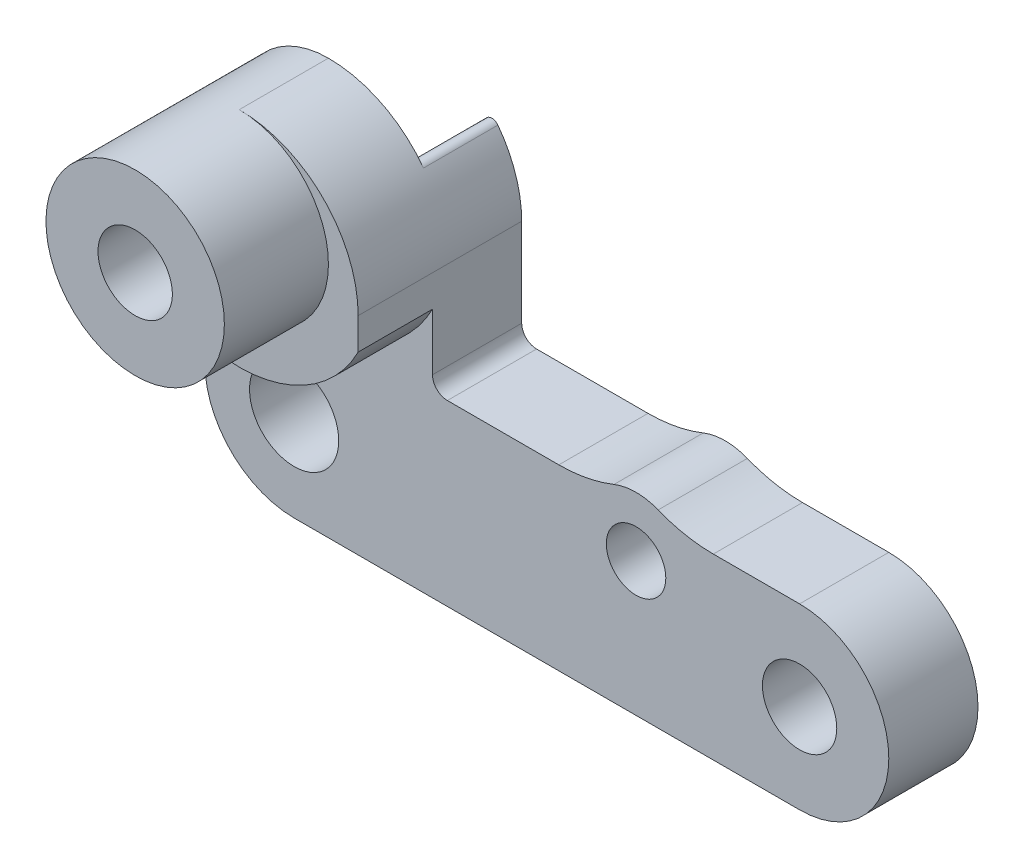
ISO-10303-21;
HEADER;
FILE_DESCRIPTION(('STEP AP214'),'2;1');
FILE_NAME('part.step','',(''),(''),'','','');
FILE_SCHEMA(('AUTOMOTIVE_DESIGN { 1 0 10303 214 1 1 1 1 }'));
ENDSEC;
DATA;
#1=APPLICATION_CONTEXT('core data for automotive mechanical design processes');
#2=APPLICATION_PROTOCOL_DEFINITION('international standard','automotive_design',2000,#1);
#3=PRODUCT_CONTEXT('',#1,'mechanical');
#4=PRODUCT('Part','Part','',(#3));
#5=PRODUCT_RELATED_PRODUCT_CATEGORY('part','',(#4));
#6=PRODUCT_DEFINITION_FORMATION('','',#4);
#7=PRODUCT_DEFINITION_CONTEXT('part definition',#1,'design');
#8=PRODUCT_DEFINITION('design','',#6,#7);
#9=PRODUCT_DEFINITION_SHAPE('','',#8);
#10=(LENGTH_UNIT() NAMED_UNIT(*) SI_UNIT(.MILLI.,.METRE.));
#11=(NAMED_UNIT(*) PLANE_ANGLE_UNIT() SI_UNIT($,.RADIAN.));
#12=(NAMED_UNIT(*) SI_UNIT($,.STERADIAN.) SOLID_ANGLE_UNIT());
#13=UNCERTAINTY_MEASURE_WITH_UNIT(LENGTH_MEASURE(1.E-05),#10,'distance_accuracy_value','');
#14=(GEOMETRIC_REPRESENTATION_CONTEXT(3) GLOBAL_UNCERTAINTY_ASSIGNED_CONTEXT((#13)) GLOBAL_UNIT_ASSIGNED_CONTEXT((#10,
#11,#12)) REPRESENTATION_CONTEXT('',''));
#15=CARTESIAN_POINT('',(0.,0.,0.));
#16=DIRECTION('',(0.,0.,1.));
#17=DIRECTION('',(1.,0.,0.));
#18=AXIS2_PLACEMENT_3D('',#15,#16,#17);
#19=CARTESIAN_POINT('',(0.,3.52853976431191,4.));
#20=DIRECTION('',(0.,-1.,0.));
#21=DIRECTION('',(1.,0.,0.));
#22=AXIS2_PLACEMENT_3D('',#19,#20,#21);
#23=PLANE('',#22);
#24=DIRECTION('',(-1.,0.,0.));
#25=VECTOR('',#24,1.);
#26=CARTESIAN_POINT('',(0.,3.52853976431191,1.));
#27=LINE('',#26,#25);
#28=CARTESIAN_POINT('',(16.3463319293926,3.52853976431191,1.));
#29=VERTEX_POINT('',#28);
#30=CARTESIAN_POINT('',(13.4444081407459,3.52853976431191,1.));
#31=VERTEX_POINT('',#30);
#32=EDGE_CURVE('E348',#29,#31,#27,.T.);
#33=ORIENTED_EDGE('',*,*,#32,.T.);
#34=DIRECTION('',(0.,0.,1.));
#35=VECTOR('',#34,1.);
#36=CARTESIAN_POINT('',(13.4444081407459,3.52853976431191,4.));
#37=LINE('',#36,#35);
#38=CARTESIAN_POINT('',(13.4444081407459,3.52853976431191,4.));
#39=VERTEX_POINT('',#38);
#40=EDGE_CURVE('E412',#31,#39,#37,.T.);
#41=ORIENTED_EDGE('',*,*,#40,.T.);
#42=DIRECTION('',(-1.,0.,0.));
#43=VECTOR('',#42,1.);
#44=CARTESIAN_POINT('',(0.,3.52853976431191,4.));
#45=LINE('',#44,#43);
#46=CARTESIAN_POINT('',(16.3463319293926,3.52853976431191,4.));
#47=VERTEX_POINT('',#46);
#48=EDGE_CURVE('E271',#47,#39,#45,.T.);
#49=ORIENTED_EDGE('',*,*,#48,.F.);
#50=DIRECTION('',(0.,0.,-1.));
#51=VECTOR('',#50,1.);
#52=CARTESIAN_POINT('',(16.3463319293926,3.52853976431191,4.));
#53=LINE('',#52,#51);
#54=EDGE_CURVE('E294',#47,#29,#53,.T.);
#55=ORIENTED_EDGE('',*,*,#54,.T.);
#56=EDGE_LOOP('',(#33,#41,#49,#55));
#57=FACE_BOUND('',#56,.T.);
#58=ADVANCED_FACE('F41',(#57),#23,.F.);
#59=CARTESIAN_POINT('',(0.,8.,10.));
#60=DIRECTION('',(0.,0.,-1.));
#61=DIRECTION('',(-1.,0.,0.));
#62=AXIS2_PLACEMENT_3D('',#59,#60,#61);
#63=CYLINDRICAL_SURFACE('',#62,3.);
#64=CARTESIAN_POINT('',(0.,8.,6.5));
#65=DIRECTION('',(0.,0.,1.));
#66=DIRECTION('',(1.,0.,0.));
#67=AXIS2_PLACEMENT_3D('',#64,#65,#66);
#68=CIRCLE('',#67,3.);
#69=CARTESIAN_POINT('',(0.,11.,6.5));
#70=VERTEX_POINT('',#69);
#71=CARTESIAN_POINT('',(-2.93253436583307,7.36735302639778,6.5));
#72=VERTEX_POINT('',#71);
#73=EDGE_CURVE('E229',#70,#72,#68,.F.);
#74=ORIENTED_EDGE('',*,*,#73,.F.);
#75=DIRECTION('',(0.,0.,-1.));
#76=VECTOR('',#75,1.);
#77=CARTESIAN_POINT('',(0.,11.,4.));
#78=LINE('',#77,#76);
#79=CARTESIAN_POINT('',(0.,11.,3.5));
#80=VERTEX_POINT('',#79);
#81=EDGE_CURVE('E286',#70,#80,#78,.T.);
#82=ORIENTED_EDGE('',*,*,#81,.T.);
#83=CARTESIAN_POINT('',(0.,8.,3.5));
#84=DIRECTION('',(0.,0.,-1.));
#85=DIRECTION('',(-1.,0.,0.));
#86=AXIS2_PLACEMENT_3D('',#83,#84,#85);
#87=CIRCLE('',#86,3.);
#88=CARTESIAN_POINT('',(-2.93253436583307,7.36735302639777,3.5));
#89=VERTEX_POINT('',#88);
#90=EDGE_CURVE('E245',#89,#80,#87,.T.);
#91=ORIENTED_EDGE('',*,*,#90,.F.);
#92=DIRECTION('',(0.,0.,-1.));
#93=VECTOR('',#92,1.);
#94=CARTESIAN_POINT('',(-2.93253436583307,7.36735302639777,4.));
#95=LINE('',#94,#93);
#96=EDGE_CURVE('E282',#72,#89,#95,.T.);
#97=ORIENTED_EDGE('',*,*,#96,.F.);
#98=EDGE_LOOP('',(#74,#82,#91,#97));
#99=FACE_BOUND('',#98,.T.);
#100=CARTESIAN_POINT('',(0.,8.,10.));
#101=DIRECTION('',(0.,0.,1.));
#102=DIRECTION('',(1.,0.,0.));
#103=AXIS2_PLACEMENT_3D('',#100,#101,#102);
#104=CIRCLE('',#103,3.);
#105=CARTESIAN_POINT('',(3.,8.,10.));
#106=VERTEX_POINT('',#105);
#107=EDGE_CURVE('E306',#106,#106,#104,.T.);
#108=ORIENTED_EDGE('',*,*,#107,.F.);
#109=EDGE_LOOP('',(#108));
#110=FACE_BOUND('',#109,.T.);
#111=ADVANCED_FACE('F461',(#99,#110),#63,.T.);
#112=CARTESIAN_POINT('',(0.,8.,10.));
#113=DIRECTION('',(0.,0.,-1.));
#114=DIRECTION('',(-1.,0.,0.));
#115=AXIS2_PLACEMENT_3D('',#112,#113,#114);
#116=CYLINDRICAL_SURFACE('',#115,1.25);
#117=CARTESIAN_POINT('',(0.,8.,10.));
#118=DIRECTION('',(0.,0.,-1.));
#119=DIRECTION('',(-1.,0.,0.));
#120=AXIS2_PLACEMENT_3D('',#117,#118,#119);
#121=CIRCLE('',#120,1.25);
#122=CARTESIAN_POINT('',(-1.25,8.,10.));
#123=VERTEX_POINT('',#122);
#124=EDGE_CURVE('E254',#123,#123,#121,.T.);
#125=ORIENTED_EDGE('',*,*,#124,.F.);
#126=EDGE_LOOP('',(#125));
#127=FACE_BOUND('',#126,.T.);
#128=CARTESIAN_POINT('',(0.,8.,3.5));
#129=DIRECTION('',(0.,0.,-1.));
#130=DIRECTION('',(-1.,0.,0.));
#131=AXIS2_PLACEMENT_3D('',#128,#129,#130);
#132=CIRCLE('',#131,1.25);
#133=CARTESIAN_POINT('',(-1.25,8.,3.5));
#134=VERTEX_POINT('',#133);
#135=EDGE_CURVE('E244',#134,#134,#132,.F.);
#136=ORIENTED_EDGE('',*,*,#135,.F.);
#137=EDGE_LOOP('',(#136));
#138=FACE_BOUND('',#137,.T.);
#139=ADVANCED_FACE('F522',(#127,#138),#116,.F.);
#140=CARTESIAN_POINT('',(0.,0.,10.));
#141=DIRECTION('',(0.,0.,1.));
#142=DIRECTION('',(1.,0.,0.));
#143=AXIS2_PLACEMENT_3D('',#140,#141,#142);
#144=PLANE('',#143);
#145=ORIENTED_EDGE('',*,*,#124,.T.);
#146=EDGE_LOOP('',(#145));
#147=FACE_BOUND('',#146,.T.);
#148=ORIENTED_EDGE('',*,*,#107,.T.);
#149=EDGE_LOOP('',(#148));
#150=FACE_BOUND('',#149,.T.);
#151=ADVANCED_FACE('F541',(#147,#150),#144,.T.);
#152=CARTESIAN_POINT('',(0.,0.,1.));
#153=DIRECTION('',(0.,0.,1.));
#154=DIRECTION('',(1.,0.,0.));
#155=AXIS2_PLACEMENT_3D('',#152,#153,#154);
#156=PLANE('',#155);
#157=CARTESIAN_POINT('',(-0.653668070607438,0.528539764311908,1.));
#158=DIRECTION('',(0.,0.,-1.));
#159=DIRECTION('',(-1.,0.,0.));
#160=AXIS2_PLACEMENT_3D('',#157,#158,#159);
#161=CIRCLE('',#160,1.5);
#162=CARTESIAN_POINT('',(-2.15366807060744,0.528539764311908,1.));
#163=VERTEX_POINT('',#162);
#164=EDGE_CURVE('E253',#163,#163,#161,.T.);
#165=ORIENTED_EDGE('',*,*,#164,.F.);
#166=EDGE_LOOP('',(#165));
#167=FACE_BOUND('',#166,.T.);
#168=CARTESIAN_POINT('',(16.3463319293926,0.528539764311909,1.));
#169=DIRECTION('',(0.,0.,-1.));
#170=DIRECTION('',(-1.,0.,0.));
#171=AXIS2_PLACEMENT_3D('',#168,#169,#170);
#172=CIRCLE('',#171,1.25);
#173=CARTESIAN_POINT('',(15.0963319293926,0.528539764311909,1.));
#174=VERTEX_POINT('',#173);
#175=EDGE_CURVE('E258',#174,#174,#172,.T.);
#176=ORIENTED_EDGE('',*,*,#175,.F.);
#177=EDGE_LOOP('',(#176));
#178=FACE_BOUND('',#177,.T.);
#179=CARTESIAN_POINT('',(8.24825571803925,3.52853976431191,1.));
#180=VERTEX_POINT('',#179);
#181=CARTESIAN_POINT('',(4.5,3.52853976431191,1.));
#182=VERTEX_POINT('',#181);
#183=EDGE_CURVE('E347',#180,#182,#27,.T.);
#184=ORIENTED_EDGE('',*,*,#183,.F.);
#185=CARTESIAN_POINT('',(8.24825571803925,8.52853976431191,1.));
#186=DIRECTION('',(0.,0.,1.));
#187=DIRECTION('',(1.,0.,0.));
#188=AXIS2_PLACEMENT_3D('',#185,#186,#187);
#189=CIRCLE('',#188,5.);
#190=CARTESIAN_POINT('',(10.1040244404345,3.88568262145476,1.));
#191=VERTEX_POINT('',#190);
#192=EDGE_CURVE('E50',#180,#191,#189,.T.);
#193=ORIENTED_EDGE('',*,*,#192,.T.);
#194=CARTESIAN_POINT('',(10.8463319293926,2.02853976431191,1.));
#195=DIRECTION('',(0.,0.,1.));
#196=DIRECTION('',(1.,0.,0.));
#197=AXIS2_PLACEMENT_3D('',#194,#195,#196);
#198=CIRCLE('',#197,2.);
#199=CARTESIAN_POINT('',(11.5886394183507,3.88568262145476,1.));
#200=VERTEX_POINT('',#199);
#201=EDGE_CURVE('E437',#200,#191,#198,.T.);
#202=ORIENTED_EDGE('',*,*,#201,.F.);
#203=CARTESIAN_POINT('',(13.4444081407459,8.52853976431191,1.));
#204=DIRECTION('',(0.,0.,1.));
#205=DIRECTION('',(1.,0.,0.));
#206=AXIS2_PLACEMENT_3D('',#203,#204,#205);
#207=CIRCLE('',#206,5.);
#208=EDGE_CURVE('E428',#200,#31,#207,.T.);
#209=ORIENTED_EDGE('',*,*,#208,.T.);
#210=ORIENTED_EDGE('',*,*,#32,.F.);
#211=CARTESIAN_POINT('',(16.3463319293926,0.528539764311909,1.));
#212=DIRECTION('',(0.,0.,1.));
#213=DIRECTION('',(1.,0.,0.));
#214=AXIS2_PLACEMENT_3D('',#211,#212,#213);
#215=CIRCLE('',#214,3.);
#216=CARTESIAN_POINT('',(16.3463319293926,-2.47146023568809,1.));
#217=VERTEX_POINT('',#216);
#218=EDGE_CURVE('E344',#217,#29,#215,.T.);
#219=ORIENTED_EDGE('',*,*,#218,.F.);
#220=DIRECTION('',(1.,0.,0.));
#221=VECTOR('',#220,1.);
#222=CARTESIAN_POINT('',(0.,-2.47146023568809,1.));
#223=LINE('',#222,#221);
#224=CARTESIAN_POINT('',(-0.653668070607438,-2.47146023568809,1.));
#225=VERTEX_POINT('',#224);
#226=EDGE_CURVE('E341',#225,#217,#223,.T.);
#227=ORIENTED_EDGE('',*,*,#226,.F.);
#228=CARTESIAN_POINT('',(-0.653668070607438,0.528539764311908,1.));
#229=DIRECTION('',(0.,0.,1.));
#230=DIRECTION('',(1.,0.,0.));
#231=AXIS2_PLACEMENT_3D('',#228,#229,#230);
#232=CIRCLE('',#231,3.);
#233=CARTESIAN_POINT('',(-3.43179265598205,1.66080465740765,1.));
#234=VERTEX_POINT('',#233);
#235=EDGE_CURVE('E315',#234,#225,#232,.T.);
#236=ORIENTED_EDGE('',*,*,#235,.F.);
#237=CARTESIAN_POINT('',(-12.4143954820266,5.32179447841723,1.));
#238=DIRECTION('',(0.,0.,1.));
#239=DIRECTION('',(1.,0.,0.));
#240=AXIS2_PLACEMENT_3D('',#237,#238,#239);
#241=CIRCLE('',#240,9.7);
#242=CARTESIAN_POINT('',(-2.73084398158035,5.8864451121761,1.));
#243=VERTEX_POINT('',#242);
#244=EDGE_CURVE('E264',#243,#234,#241,.F.);
#245=ORIENTED_EDGE('',*,*,#244,.F.);
#246=CARTESIAN_POINT('',(-2.48126791198122,5.90099796356164,1.));
#247=DIRECTION('',(0.,0.,1.));
#248=DIRECTION('',(1.,0.,0.));
#249=AXIS2_PLACEMENT_3D('',#246,#247,#248);
#250=CIRCLE('',#249,0.25);
#251=CARTESIAN_POINT('',(-2.29040114952112,6.06245965867228,1.));
#252=VERTEX_POINT('',#251);
#253=EDGE_CURVE('E374',#243,#252,#250,.F.);
#254=ORIENTED_EDGE('',*,*,#253,.T.);
#255=CARTESIAN_POINT('',(0.,8.,1.));
#256=DIRECTION('',(0.,0.,-1.));
#257=DIRECTION('',(-1.,0.,0.));
#258=AXIS2_PLACEMENT_3D('',#255,#256,#257);
#259=CIRCLE('',#258,3.);
#260=CARTESIAN_POINT('',(2.76923076923077,9.15384615384616,1.));
#261=VERTEX_POINT('',#260);
#262=EDGE_CURVE('E197',#261,#252,#259,.T.);
#263=ORIENTED_EDGE('',*,*,#262,.F.);
#264=CARTESIAN_POINT('',(3.,9.25,1.));
#265=DIRECTION('',(0.,0.,1.));
#266=DIRECTION('',(1.,0.,0.));
#267=AXIS2_PLACEMENT_3D('',#264,#265,#266);
#268=CIRCLE('',#267,0.25);
#269=CARTESIAN_POINT('',(3.2,9.4,1.));
#270=VERTEX_POINT('',#269);
#271=EDGE_CURVE('E371',#261,#270,#268,.F.);
#272=ORIENTED_EDGE('',*,*,#271,.T.);
#273=CARTESIAN_POINT('',(0.,7.,1.));
#274=DIRECTION('',(0.,0.,1.));
#275=DIRECTION('',(1.,0.,0.));
#276=AXIS2_PLACEMENT_3D('',#273,#274,#275);
#277=CIRCLE('',#276,4.);
#278=CARTESIAN_POINT('',(4.,7.,1.));
#279=VERTEX_POINT('',#278);
#280=EDGE_CURVE('E337',#270,#279,#277,.F.);
#281=ORIENTED_EDGE('',*,*,#280,.T.);
#282=DIRECTION('',(0.,-1.,0.));
#283=VECTOR('',#282,1.);
#284=CARTESIAN_POINT('',(4.,0.,1.));
#285=LINE('',#284,#283);
#286=CARTESIAN_POINT('',(4.,4.02853976431191,1.));
#287=VERTEX_POINT('',#286);
#288=EDGE_CURVE('E352',#279,#287,#285,.T.);
#289=ORIENTED_EDGE('',*,*,#288,.T.);
#290=CARTESIAN_POINT('',(4.5,4.02853976431191,1.));
#291=DIRECTION('',(0.,0.,1.));
#292=DIRECTION('',(1.,0.,0.));
#293=AXIS2_PLACEMENT_3D('',#290,#291,#292);
#294=CIRCLE('',#293,0.5);
#295=EDGE_CURVE('E323',#287,#182,#294,.T.);
#296=ORIENTED_EDGE('',*,*,#295,.T.);
#297=EDGE_LOOP('',(#184,#193,#202,#209,#210,#219,#227,#236,#245,#254,#263,#272,#281,#289,#296));
#298=FACE_BOUND('',#297,.T.);
#299=CARTESIAN_POINT('',(10.8463319293926,2.02853976431191,0.999999999999999));
#300=DIRECTION('',(0.,0.,1.));
#301=DIRECTION('',(1.,0.,0.));
#302=AXIS2_PLACEMENT_3D('',#299,#300,#301);
#303=CIRCLE('',#302,1.);
#304=CARTESIAN_POINT('',(11.8463319293926,2.02853976431191,0.999999999999999));
#305=VERTEX_POINT('',#304);
#306=EDGE_CURVE('E220',#305,#305,#303,.T.);
#307=ORIENTED_EDGE('',*,*,#306,.T.);
#308=EDGE_LOOP('',(#307));
#309=FACE_BOUND('',#308,.T.);
#310=ADVANCED_FACE('F435',(#167,#178,#298,#309),#156,.F.);
#311=CARTESIAN_POINT('',(-0.653668070607438,0.528539764311908,4.));
#312=DIRECTION('',(0.,0.,-1.));
#313=DIRECTION('',(-1.,0.,0.));
#314=AXIS2_PLACEMENT_3D('',#311,#312,#313);
#315=CYLINDRICAL_SURFACE('',#314,3.);
#316=ORIENTED_EDGE('',*,*,#235,.T.);
#317=DIRECTION('',(0.,0.,-1.));
#318=VECTOR('',#317,1.);
#319=CARTESIAN_POINT('',(-0.653668070607438,-2.47146023568809,4.));
#320=LINE('',#319,#318);
#321=CARTESIAN_POINT('',(-0.653668070607438,-2.47146023568809,4.));
#322=VERTEX_POINT('',#321);
#323=EDGE_CURVE('E302',#322,#225,#320,.T.);
#324=ORIENTED_EDGE('',*,*,#323,.F.);
#325=CARTESIAN_POINT('',(-0.653668070607438,0.528539764311908,4.));
#326=DIRECTION('',(0.,0.,1.));
#327=DIRECTION('',(1.,0.,0.));
#328=AXIS2_PLACEMENT_3D('',#325,#326,#327);
#329=CIRCLE('',#328,3.);
#330=CARTESIAN_POINT('',(-3.43179265598205,1.66080465740766,4.));
#331=VERTEX_POINT('',#330);
#332=EDGE_CURVE('E259',#331,#322,#329,.T.);
#333=ORIENTED_EDGE('',*,*,#332,.F.);
#334=DIRECTION('',(0.,0.,-1.));
#335=VECTOR('',#334,1.);
#336=CARTESIAN_POINT('',(-3.43179265598205,1.66080465740765,4.));
#337=LINE('',#336,#335);
#338=EDGE_CURVE('E278',#331,#234,#337,.T.);
#339=ORIENTED_EDGE('',*,*,#338,.T.);
#340=EDGE_LOOP('',(#316,#324,#333,#339));
#341=FACE_BOUND('',#340,.T.);
#342=ADVANCED_FACE('F493',(#341),#315,.T.);
#343=CARTESIAN_POINT('',(0.,-2.47146023568809,4.));
#344=DIRECTION('',(0.,1.,0.));
#345=DIRECTION('',(0.,0.,1.));
#346=AXIS2_PLACEMENT_3D('',#343,#344,#345);
#347=PLANE('',#346);
#348=ORIENTED_EDGE('',*,*,#226,.T.);
#349=DIRECTION('',(0.,0.,-1.));
#350=VECTOR('',#349,1.);
#351=CARTESIAN_POINT('',(16.3463319293926,-2.47146023568809,4.));
#352=LINE('',#351,#350);
#353=CARTESIAN_POINT('',(16.3463319293926,-2.47146023568809,4.));
#354=VERTEX_POINT('',#353);
#355=EDGE_CURVE('E298',#354,#217,#352,.T.);
#356=ORIENTED_EDGE('',*,*,#355,.F.);
#357=DIRECTION('',(1.,0.,0.));
#358=VECTOR('',#357,1.);
#359=CARTESIAN_POINT('',(0.,-2.47146023568809,4.));
#360=LINE('',#359,#358);
#361=EDGE_CURVE('E263',#322,#354,#360,.T.);
#362=ORIENTED_EDGE('',*,*,#361,.F.);
#363=ORIENTED_EDGE('',*,*,#323,.T.);
#364=EDGE_LOOP('',(#348,#356,#362,#363));
#365=FACE_BOUND('',#364,.T.);
#366=ADVANCED_FACE('F531',(#365),#347,.F.);
#367=CARTESIAN_POINT('',(16.3463319293926,0.528539764311909,4.));
#368=DIRECTION('',(0.,0.,-1.));
#369=DIRECTION('',(-1.,0.,0.));
#370=AXIS2_PLACEMENT_3D('',#367,#368,#369);
#371=CYLINDRICAL_SURFACE('',#370,3.);
#372=ORIENTED_EDGE('',*,*,#218,.T.);
#373=ORIENTED_EDGE('',*,*,#54,.F.);
#374=CARTESIAN_POINT('',(16.3463319293926,0.528539764311909,4.));
#375=DIRECTION('',(0.,0.,1.));
#376=DIRECTION('',(1.,0.,0.));
#377=AXIS2_PLACEMENT_3D('',#374,#375,#376);
#378=CIRCLE('',#377,3.);
#379=EDGE_CURVE('E267',#354,#47,#378,.T.);
#380=ORIENTED_EDGE('',*,*,#379,.F.);
#381=ORIENTED_EDGE('',*,*,#355,.T.);
#382=EDGE_LOOP('',(#372,#373,#380,#381));
#383=FACE_BOUND('',#382,.T.);
#384=ADVANCED_FACE('F526',(#383),#371,.T.);
#385=CARTESIAN_POINT('',(8.24825571803925,3.52853976431191,4.));
#386=VERTEX_POINT('',#385);
#387=CARTESIAN_POINT('',(4.5,3.52853976431191,4.));
#388=VERTEX_POINT('',#387);
#389=EDGE_CURVE('E270',#386,#388,#45,.T.);
#390=ORIENTED_EDGE('',*,*,#389,.F.);
#391=DIRECTION('',(0.,0.,1.));
#392=VECTOR('',#391,1.);
#393=CARTESIAN_POINT('',(8.24825571803925,3.52853976431191,4.));
#394=LINE('',#393,#392);
#395=EDGE_CURVE('E422',#386,#180,#394,.F.);
#396=ORIENTED_EDGE('',*,*,#395,.T.);
#397=ORIENTED_EDGE('',*,*,#183,.T.);
#398=DIRECTION('',(0.,0.,-1.));
#399=VECTOR('',#398,1.);
#400=CARTESIAN_POINT('',(4.5,3.52853976431191,4.));
#401=LINE('',#400,#399);
#402=EDGE_CURVE('E319',#182,#388,#401,.F.);
#403=ORIENTED_EDGE('',*,*,#402,.T.);
#404=EDGE_LOOP('',(#390,#396,#397,#403));
#405=FACE_BOUND('',#404,.T.);
#406=ADVANCED_FACE('F448',(#405),#23,.F.);
#407=CARTESIAN_POINT('',(4.,0.,4.));
#408=DIRECTION('',(1.,0.,0.));
#409=DIRECTION('',(0.,0.,-1.));
#410=AXIS2_PLACEMENT_3D('',#407,#408,#409);
#411=PLANE('',#410);
#412=DIRECTION('',(0.,0.,-1.));
#413=VECTOR('',#412,1.);
#414=CARTESIAN_POINT('',(4.,7.,4.));
#415=LINE('',#414,#413);
#416=CARTESIAN_POINT('',(4.,7.,6.5));
#417=VERTEX_POINT('',#416);
#418=EDGE_CURVE('E290',#417,#279,#415,.T.);
#419=ORIENTED_EDGE('',*,*,#418,.F.);
#420=DIRECTION('',(0.,1.,0.));
#421=VECTOR('',#420,1.);
#422=CARTESIAN_POINT('',(4.,0.,6.5));
#423=LINE('',#422,#421);
#424=CARTESIAN_POINT('',(4.,5.93844718719117,6.5));
#425=VERTEX_POINT('',#424);
#426=EDGE_CURVE('E208',#425,#417,#423,.T.);
#427=ORIENTED_EDGE('',*,*,#426,.F.);
#428=DIRECTION('',(0.,0.,-1.));
#429=VECTOR('',#428,1.);
#430=CARTESIAN_POINT('',(4.,5.93844718719117,6.5));
#431=LINE('',#430,#429);
#432=CARTESIAN_POINT('',(4.,5.93844718719117,4.));
#433=VERTEX_POINT('',#432);
#434=EDGE_CURVE('E198',#425,#433,#431,.T.);
#435=ORIENTED_EDGE('',*,*,#434,.T.);
#436=DIRECTION('',(0.,-1.,0.));
#437=VECTOR('',#436,1.);
#438=CARTESIAN_POINT('',(4.,0.,4.));
#439=LINE('',#438,#437);
#440=CARTESIAN_POINT('',(4.,4.02853976431191,4.));
#441=VERTEX_POINT('',#440);
#442=EDGE_CURVE('E275',#433,#441,#439,.T.);
#443=ORIENTED_EDGE('',*,*,#442,.T.);
#444=DIRECTION('',(0.,0.,-1.));
#445=VECTOR('',#444,1.);
#446=CARTESIAN_POINT('',(4.,4.02853976431191,4.));
#447=LINE('',#446,#445);
#448=EDGE_CURVE('E310',#441,#287,#447,.T.);
#449=ORIENTED_EDGE('',*,*,#448,.T.);
#450=ORIENTED_EDGE('',*,*,#288,.F.);
#451=EDGE_LOOP('',(#419,#427,#435,#443,#449,#450));
#452=FACE_BOUND('',#451,.T.);
#453=ADVANCED_FACE('F487',(#452),#411,.T.);
#454=CARTESIAN_POINT('',(0.,7.,4.));
#455=DIRECTION('',(0.,0.,-1.));
#456=DIRECTION('',(-1.,0.,0.));
#457=AXIS2_PLACEMENT_3D('',#454,#455,#456);
#458=CYLINDRICAL_SURFACE('',#457,4.);
#459=ORIENTED_EDGE('',*,*,#280,.F.);
#460=DIRECTION('',(0.,0.,-1.));
#461=VECTOR('',#460,1.);
#462=CARTESIAN_POINT('',(3.2,9.4,4.));
#463=LINE('',#462,#461);
#464=CARTESIAN_POINT('',(3.2,9.4,3.5));
#465=VERTEX_POINT('',#464);
#466=EDGE_CURVE('E387',#270,#465,#463,.F.);
#467=ORIENTED_EDGE('',*,*,#466,.T.);
#468=CARTESIAN_POINT('',(0.,7.,3.5));
#469=DIRECTION('',(0.,0.,-1.));
#470=DIRECTION('',(-1.,0.,0.));
#471=AXIS2_PLACEMENT_3D('',#468,#469,#470);
#472=CIRCLE('',#471,4.);
#473=EDGE_CURVE('E384',#465,#80,#472,.F.);
#474=ORIENTED_EDGE('',*,*,#473,.T.);
#475=ORIENTED_EDGE('',*,*,#81,.F.);
#476=CARTESIAN_POINT('',(0.,7.,6.5));
#477=DIRECTION('',(0.,0.,1.));
#478=DIRECTION('',(1.,0.,0.));
#479=AXIS2_PLACEMENT_3D('',#476,#477,#478);
#480=CIRCLE('',#479,4.);
#481=EDGE_CURVE('E225',#417,#70,#480,.T.);
#482=ORIENTED_EDGE('',*,*,#481,.F.);
#483=ORIENTED_EDGE('',*,*,#418,.T.);
#484=EDGE_LOOP('',(#459,#467,#474,#475,#482,#483));
#485=FACE_BOUND('',#484,.T.);
#486=ADVANCED_FACE('F466',(#485),#458,.T.);
#487=CARTESIAN_POINT('',(-12.4143954820266,5.32179447841723,4.));
#488=DIRECTION('',(0.,0.,-1.));
#489=DIRECTION('',(-1.,0.,0.));
#490=AXIS2_PLACEMENT_3D('',#487,#488,#489);
#491=CYLINDRICAL_SURFACE('',#490,9.7);
#492=ORIENTED_EDGE('',*,*,#338,.F.);
#493=CARTESIAN_POINT('',(-12.4143954820266,5.32179447841723,4.));
#494=DIRECTION('',(0.,0.,1.));
#495=DIRECTION('',(1.,0.,0.));
#496=AXIS2_PLACEMENT_3D('',#493,#494,#495);
#497=CIRCLE('',#496,9.7);
#498=CARTESIAN_POINT('',(-2.85649260310096,3.66755974385741,4.));
#499=VERTEX_POINT('',#498);
#500=EDGE_CURVE('E403',#331,#499,#497,.T.);
#501=ORIENTED_EDGE('',*,*,#500,.T.);
#502=DIRECTION('',(0.,0.,-1.));
#503=VECTOR('',#502,1.);
#504=CARTESIAN_POINT('',(-2.85649260310096,3.66755974385741,4.));
#505=LINE('',#504,#503);
#506=CARTESIAN_POINT('',(-2.85649260310096,3.66755974385741,6.5));
#507=VERTEX_POINT('',#506);
#508=EDGE_CURVE('E400',#499,#507,#505,.F.);
#509=ORIENTED_EDGE('',*,*,#508,.T.);
#510=CARTESIAN_POINT('',(-12.4143954820266,5.32179447841723,6.5));
#511=DIRECTION('',(0.,0.,1.));
#512=DIRECTION('',(1.,0.,0.));
#513=AXIS2_PLACEMENT_3D('',#510,#511,#512);
#514=CIRCLE('',#513,9.7);
#515=EDGE_CURVE('E233',#72,#507,#514,.F.);
#516=ORIENTED_EDGE('',*,*,#515,.F.);
#517=ORIENTED_EDGE('',*,*,#96,.T.);
#518=CARTESIAN_POINT('',(-12.4143954820266,5.32179447841723,3.5));
#519=DIRECTION('',(0.,0.,-1.));
#520=DIRECTION('',(-1.,0.,0.));
#521=AXIS2_PLACEMENT_3D('',#518,#519,#520);
#522=CIRCLE('',#521,9.7);
#523=CARTESIAN_POINT('',(-2.73084398158035,5.8864451121761,3.5));
#524=VERTEX_POINT('',#523);
#525=EDGE_CURVE('E328',#89,#524,#522,.T.);
#526=ORIENTED_EDGE('',*,*,#525,.T.);
#527=DIRECTION('',(0.,0.,-1.));
#528=VECTOR('',#527,1.);
#529=CARTESIAN_POINT('',(-2.73084398158035,5.8864451121761,4.));
#530=LINE('',#529,#528);
#531=EDGE_CURVE('E367',#524,#243,#530,.T.);
#532=ORIENTED_EDGE('',*,*,#531,.T.);
#533=ORIENTED_EDGE('',*,*,#244,.T.);
#534=EDGE_LOOP('',(#492,#501,#509,#516,#517,#526,#532,#533));
#535=FACE_BOUND('',#534,.T.);
#536=ADVANCED_FACE('F483',(#535),#491,.F.);
#537=CARTESIAN_POINT('',(0.,0.,4.));
#538=DIRECTION('',(0.,0.,1.));
#539=DIRECTION('',(1.,0.,0.));
#540=AXIS2_PLACEMENT_3D('',#537,#538,#539);
#541=PLANE('',#540);
#542=ORIENTED_EDGE('',*,*,#48,.T.);
#543=CARTESIAN_POINT('',(13.4444081407459,8.52853976431191,4.));
#544=DIRECTION('',(0.,0.,1.));
#545=DIRECTION('',(1.,0.,0.));
#546=AXIS2_PLACEMENT_3D('',#543,#544,#545);
#547=CIRCLE('',#546,5.);
#548=CARTESIAN_POINT('',(11.5886394183507,3.88568262145476,4.));
#549=VERTEX_POINT('',#548);
#550=EDGE_CURVE('E425',#39,#549,#547,.F.);
#551=ORIENTED_EDGE('',*,*,#550,.T.);
#552=CARTESIAN_POINT('',(10.8463319293926,2.02853976431191,4.));
#553=DIRECTION('',(0.,0.,1.));
#554=DIRECTION('',(1.,0.,0.));
#555=AXIS2_PLACEMENT_3D('',#552,#553,#554);
#556=CIRCLE('',#555,2.);
#557=CARTESIAN_POINT('',(10.1040244404345,3.88568262145476,4.));
#558=VERTEX_POINT('',#557);
#559=EDGE_CURVE('E445',#549,#558,#556,.T.);
#560=ORIENTED_EDGE('',*,*,#559,.T.);
#561=CARTESIAN_POINT('',(8.24825571803925,8.52853976431191,4.));
#562=DIRECTION('',(0.,0.,1.));
#563=DIRECTION('',(1.,0.,0.));
#564=AXIS2_PLACEMENT_3D('',#561,#562,#563);
#565=CIRCLE('',#564,5.);
#566=EDGE_CURVE('E11',#558,#386,#565,.F.);
#567=ORIENTED_EDGE('',*,*,#566,.T.);
#568=ORIENTED_EDGE('',*,*,#389,.T.);
#569=CARTESIAN_POINT('',(4.5,4.02853976431191,4.));
#570=DIRECTION('',(0.,0.,1.));
#571=DIRECTION('',(1.,0.,0.));
#572=AXIS2_PLACEMENT_3D('',#569,#570,#571);
#573=CIRCLE('',#572,0.5);
#574=EDGE_CURVE('E324',#388,#441,#573,.F.);
#575=ORIENTED_EDGE('',*,*,#574,.T.);
#576=ORIENTED_EDGE('',*,*,#442,.F.);
#577=CARTESIAN_POINT('',(0.,8.,4.));
#578=DIRECTION('',(0.,0.,1.));
#579=DIRECTION('',(1.,0.,0.));
#580=AXIS2_PLACEMENT_3D('',#577,#578,#579);
#581=CIRCLE('',#580,4.5);
#582=CARTESIAN_POINT('',(-0.392200842364463,3.51712385858714,4.));
#583=VERTEX_POINT('',#582);
#584=EDGE_CURVE('E215',#583,#433,#581,.T.);
#585=ORIENTED_EDGE('',*,*,#584,.F.);
#586=CARTESIAN_POINT('',(-0.653668070607438,0.528539764311908,4.));
#587=DIRECTION('',(0.,0.,1.));
#588=DIRECTION('',(1.,0.,0.));
#589=AXIS2_PLACEMENT_3D('',#586,#587,#588);
#590=CIRCLE('',#589,3.);
#591=CARTESIAN_POINT('',(-2.11951017891887,3.14603989105519,4.));
#592=VERTEX_POINT('',#591);
#593=EDGE_CURVE('E193',#583,#592,#590,.T.);
#594=ORIENTED_EDGE('',*,*,#593,.T.);
#595=CARTESIAN_POINT('',(-2.36381719697077,3.58228991217907,4.));
#596=DIRECTION('',(0.,0.,1.));
#597=DIRECTION('',(1.,0.,0.));
#598=AXIS2_PLACEMENT_3D('',#595,#596,#597);
#599=CIRCLE('',#598,0.5);
#600=EDGE_CURVE('E409',#592,#499,#599,.F.);
#601=ORIENTED_EDGE('',*,*,#600,.T.);
#602=ORIENTED_EDGE('',*,*,#500,.F.);
#603=ORIENTED_EDGE('',*,*,#332,.T.);
#604=ORIENTED_EDGE('',*,*,#361,.T.);
#605=ORIENTED_EDGE('',*,*,#379,.T.);
#606=EDGE_LOOP('',(#542,#551,#560,#567,#568,#575,#576,#585,#594,#601,#602,#603,#604,#605));
#607=FACE_BOUND('',#606,.T.);
#608=CARTESIAN_POINT('',(-0.653668070607438,0.528539764311908,4.));
#609=DIRECTION('',(0.,0.,1.));
#610=DIRECTION('',(1.,0.,0.));
#611=AXIS2_PLACEMENT_3D('',#608,#609,#610);
#612=CIRCLE('',#611,1.5);
#613=CARTESIAN_POINT('',(0.846331929392562,0.528539764311908,4.));
#614=VERTEX_POINT('',#613);
#615=EDGE_CURVE('E249',#614,#614,#612,.F.);
#616=ORIENTED_EDGE('',*,*,#615,.T.);
#617=EDGE_LOOP('',(#616));
#618=FACE_BOUND('',#617,.T.);
#619=CARTESIAN_POINT('',(16.3463319293926,0.528539764311909,4.));
#620=DIRECTION('',(0.,0.,1.));
#621=DIRECTION('',(1.,0.,0.));
#622=AXIS2_PLACEMENT_3D('',#619,#620,#621);
#623=CIRCLE('',#622,1.25);
#624=CARTESIAN_POINT('',(17.5963319293926,0.528539764311909,4.));
#625=VERTEX_POINT('',#624);
#626=EDGE_CURVE('E311',#625,#625,#623,.T.);
#627=ORIENTED_EDGE('',*,*,#626,.F.);
#628=EDGE_LOOP('',(#627));
#629=FACE_BOUND('',#628,.T.);
#630=CARTESIAN_POINT('',(10.8463319293926,2.02853976431191,4.));
#631=DIRECTION('',(0.,0.,1.));
#632=DIRECTION('',(1.,0.,0.));
#633=AXIS2_PLACEMENT_3D('',#630,#631,#632);
#634=CIRCLE('',#633,1.);
#635=CARTESIAN_POINT('',(11.8463319293926,2.02853976431191,4.));
#636=VERTEX_POINT('',#635);
#637=EDGE_CURVE('E444',#636,#636,#634,.T.);
#638=ORIENTED_EDGE('',*,*,#637,.F.);
#639=EDGE_LOOP('',(#638));
#640=FACE_BOUND('',#639,.T.);
#641=ADVANCED_FACE('F495',(#607,#618,#629,#640),#541,.T.);
#642=CARTESIAN_POINT('',(16.3463319293926,0.528539764311909,10.));
#643=DIRECTION('',(0.,0.,-1.));
#644=DIRECTION('',(-1.,0.,0.));
#645=AXIS2_PLACEMENT_3D('',#642,#643,#644);
#646=CYLINDRICAL_SURFACE('',#645,1.25);
#647=ORIENTED_EDGE('',*,*,#626,.T.);
#648=EDGE_LOOP('',(#647));
#649=FACE_BOUND('',#648,.T.);
#650=ORIENTED_EDGE('',*,*,#175,.T.);
#651=EDGE_LOOP('',(#650));
#652=FACE_BOUND('',#651,.T.);
#653=ADVANCED_FACE('F511',(#649,#652),#646,.F.);
#654=CARTESIAN_POINT('',(-0.653668070607438,0.528539764311908,10.001));
#655=DIRECTION('',(0.,0.,-1.));
#656=DIRECTION('',(-1.,0.,0.));
#657=AXIS2_PLACEMENT_3D('',#654,#655,#656);
#658=CYLINDRICAL_SURFACE('',#657,1.5);
#659=ORIENTED_EDGE('',*,*,#615,.F.);
#660=EDGE_LOOP('',(#659));
#661=FACE_BOUND('',#660,.T.);
#662=ORIENTED_EDGE('',*,*,#164,.T.);
#663=EDGE_LOOP('',(#662));
#664=FACE_BOUND('',#663,.T.);
#665=ADVANCED_FACE('F504',(#661,#664),#658,.F.);
#666=CARTESIAN_POINT('',(4.5,4.02853976431191,4.));
#667=DIRECTION('',(0.,0.,-1.));
#668=DIRECTION('',(-1.,0.,0.));
#669=AXIS2_PLACEMENT_3D('',#666,#667,#668);
#670=CYLINDRICAL_SURFACE('',#669,0.5);
#671=ORIENTED_EDGE('',*,*,#574,.F.);
#672=ORIENTED_EDGE('',*,*,#402,.F.);
#673=ORIENTED_EDGE('',*,*,#295,.F.);
#674=ORIENTED_EDGE('',*,*,#448,.F.);
#675=EDGE_LOOP('',(#671,#672,#673,#674));
#676=FACE_BOUND('',#675,.T.);
#677=ADVANCED_FACE('F502',(#676),#670,.F.);
#678=CARTESIAN_POINT('',(0.,8.,3.5));
#679=DIRECTION('',(0.,0.,-1.));
#680=DIRECTION('',(-1.,0.,0.));
#681=AXIS2_PLACEMENT_3D('',#678,#679,#680);
#682=PLANE('',#681);
#683=ORIENTED_EDGE('',*,*,#90,.T.);
#684=ORIENTED_EDGE('',*,*,#473,.F.);
#685=CARTESIAN_POINT('',(3.,9.25,3.5));
#686=DIRECTION('',(0.,0.,-1.));
#687=DIRECTION('',(-1.,0.,0.));
#688=AXIS2_PLACEMENT_3D('',#685,#686,#687);
#689=CIRCLE('',#688,0.25);
#690=CARTESIAN_POINT('',(2.76923076923077,9.15384615384616,3.5));
#691=VERTEX_POINT('',#690);
#692=EDGE_CURVE('E394',#465,#691,#689,.F.);
#693=ORIENTED_EDGE('',*,*,#692,.T.);
#694=CARTESIAN_POINT('',(-2.29040114952112,6.06245965867228,3.5));
#695=VERTEX_POINT('',#694);
#696=EDGE_CURVE('E240',#691,#695,#87,.T.);
#697=ORIENTED_EDGE('',*,*,#696,.T.);
#698=CARTESIAN_POINT('',(-2.48126791198122,5.90099796356164,3.5));
#699=DIRECTION('',(0.,0.,-1.));
#700=DIRECTION('',(-1.,0.,0.));
#701=AXIS2_PLACEMENT_3D('',#698,#699,#700);
#702=CIRCLE('',#701,0.25);
#703=EDGE_CURVE('E391',#695,#524,#702,.F.);
#704=ORIENTED_EDGE('',*,*,#703,.T.);
#705=ORIENTED_EDGE('',*,*,#525,.F.);
#706=EDGE_LOOP('',(#683,#684,#693,#697,#704,#705));
#707=FACE_BOUND('',#706,.T.);
#708=ORIENTED_EDGE('',*,*,#135,.T.);
#709=EDGE_LOOP('',(#708));
#710=FACE_BOUND('',#709,.T.);
#711=ADVANCED_FACE('F457',(#707,#710),#682,.T.);
#712=CARTESIAN_POINT('',(0.,8.,3.5));
#713=DIRECTION('',(0.,0.,-1.));
#714=DIRECTION('',(-1.,0.,0.));
#715=AXIS2_PLACEMENT_3D('',#712,#713,#714);
#716=CYLINDRICAL_SURFACE('',#715,3.);
#717=ORIENTED_EDGE('',*,*,#262,.T.);
#718=DIRECTION('',(0.,0.,-1.));
#719=VECTOR('',#718,1.);
#720=CARTESIAN_POINT('',(-2.29040114952112,6.06245965867228,3.5));
#721=LINE('',#720,#719);
#722=EDGE_CURVE('E381',#252,#695,#721,.F.);
#723=ORIENTED_EDGE('',*,*,#722,.T.);
#724=ORIENTED_EDGE('',*,*,#696,.F.);
#725=DIRECTION('',(0.,0.,-1.));
#726=VECTOR('',#725,1.);
#727=CARTESIAN_POINT('',(2.76923076923077,9.15384615384616,3.5));
#728=LINE('',#727,#726);
#729=EDGE_CURVE('E377',#691,#261,#728,.T.);
#730=ORIENTED_EDGE('',*,*,#729,.T.);
#731=EDGE_LOOP('',(#717,#723,#724,#730));
#732=FACE_BOUND('',#731,.T.);
#733=ADVANCED_FACE('F475',(#732),#716,.F.);
#734=CARTESIAN_POINT('',(-2.48126791198122,5.90099796356164,3.5));
#735=DIRECTION('',(0.,0.,-1.));
#736=DIRECTION('',(-1.,0.,0.));
#737=AXIS2_PLACEMENT_3D('',#734,#735,#736);
#738=CYLINDRICAL_SURFACE('',#737,0.25);
#739=ORIENTED_EDGE('',*,*,#703,.F.);
#740=ORIENTED_EDGE('',*,*,#722,.F.);
#741=ORIENTED_EDGE('',*,*,#253,.F.);
#742=ORIENTED_EDGE('',*,*,#531,.F.);
#743=EDGE_LOOP('',(#739,#740,#741,#742));
#744=FACE_BOUND('',#743,.T.);
#745=ADVANCED_FACE('F479',(#744),#738,.T.);
#746=CARTESIAN_POINT('',(3.,9.25,4.));
#747=DIRECTION('',(0.,0.,1.));
#748=DIRECTION('',(1.,0.,0.));
#749=AXIS2_PLACEMENT_3D('',#746,#747,#748);
#750=CYLINDRICAL_SURFACE('',#749,0.25);
#751=ORIENTED_EDGE('',*,*,#692,.F.);
#752=ORIENTED_EDGE('',*,*,#466,.F.);
#753=ORIENTED_EDGE('',*,*,#271,.F.);
#754=ORIENTED_EDGE('',*,*,#729,.F.);
#755=EDGE_LOOP('',(#751,#752,#753,#754));
#756=FACE_BOUND('',#755,.T.);
#757=ADVANCED_FACE('F471',(#756),#750,.T.);
#758=CARTESIAN_POINT('',(-0.653668070607438,0.528539764311908,6.5));
#759=DIRECTION('',(0.,0.,-1.));
#760=DIRECTION('',(-1.,0.,0.));
#761=AXIS2_PLACEMENT_3D('',#758,#759,#760);
#762=CYLINDRICAL_SURFACE('',#761,3.);
#763=CARTESIAN_POINT('',(-0.653668070607438,0.528539764311908,6.5));
#764=DIRECTION('',(0.,0.,1.));
#765=DIRECTION('',(1.,0.,0.));
#766=AXIS2_PLACEMENT_3D('',#763,#764,#765);
#767=CIRCLE('',#766,3.);
#768=CARTESIAN_POINT('',(-0.392200842364463,3.51712385858714,6.5));
#769=VERTEX_POINT('',#768);
#770=CARTESIAN_POINT('',(-2.11951017891887,3.14603989105519,6.5));
#771=VERTEX_POINT('',#770);
#772=EDGE_CURVE('E190',#769,#771,#767,.T.);
#773=ORIENTED_EDGE('',*,*,#772,.T.);
#774=DIRECTION('',(0.,0.,-1.));
#775=VECTOR('',#774,1.);
#776=CARTESIAN_POINT('',(-2.11951017891887,3.14603989105519,6.5));
#777=LINE('',#776,#775);
#778=EDGE_CURVE('E397',#771,#592,#777,.T.);
#779=ORIENTED_EDGE('',*,*,#778,.T.);
#780=ORIENTED_EDGE('',*,*,#593,.F.);
#781=DIRECTION('',(0.,0.,-1.));
#782=VECTOR('',#781,1.);
#783=CARTESIAN_POINT('',(-0.392200842364463,3.51712385858714,6.5));
#784=LINE('',#783,#782);
#785=EDGE_CURVE('E185',#769,#583,#784,.T.);
#786=ORIENTED_EDGE('',*,*,#785,.F.);
#787=EDGE_LOOP('',(#773,#779,#780,#786));
#788=FACE_BOUND('',#787,.T.);
#789=ADVANCED_FACE('F187',(#788),#762,.F.);
#790=CARTESIAN_POINT('',(0.,8.,6.5));
#791=DIRECTION('',(0.,0.,-1.));
#792=DIRECTION('',(-1.,0.,0.));
#793=AXIS2_PLACEMENT_3D('',#790,#791,#792);
#794=CYLINDRICAL_SURFACE('',#793,4.5);
#795=ORIENTED_EDGE('',*,*,#584,.T.);
#796=ORIENTED_EDGE('',*,*,#434,.F.);
#797=CARTESIAN_POINT('',(0.,8.,6.5));
#798=DIRECTION('',(0.,0.,1.));
#799=DIRECTION('',(1.,0.,0.));
#800=AXIS2_PLACEMENT_3D('',#797,#798,#799);
#801=CIRCLE('',#800,4.5);
#802=EDGE_CURVE('E201',#769,#425,#801,.T.);
#803=ORIENTED_EDGE('',*,*,#802,.F.);
#804=ORIENTED_EDGE('',*,*,#785,.T.);
#805=EDGE_LOOP('',(#795,#796,#803,#804));
#806=FACE_BOUND('',#805,.T.);
#807=ADVANCED_FACE('F202',(#806),#794,.T.);
#808=CARTESIAN_POINT('',(0.,0.,6.5));
#809=DIRECTION('',(0.,0.,1.));
#810=DIRECTION('',(1.,0.,0.));
#811=AXIS2_PLACEMENT_3D('',#808,#809,#810);
#812=PLANE('',#811);
#813=ORIENTED_EDGE('',*,*,#515,.T.);
#814=CARTESIAN_POINT('',(-2.36381719697077,3.58228991217907,6.5));
#815=DIRECTION('',(0.,0.,1.));
#816=DIRECTION('',(1.,0.,0.));
#817=AXIS2_PLACEMENT_3D('',#814,#815,#816);
#818=CIRCLE('',#817,0.5);
#819=EDGE_CURVE('E213',#507,#771,#818,.T.);
#820=ORIENTED_EDGE('',*,*,#819,.T.);
#821=ORIENTED_EDGE('',*,*,#772,.F.);
#822=ORIENTED_EDGE('',*,*,#802,.T.);
#823=ORIENTED_EDGE('',*,*,#426,.T.);
#824=ORIENTED_EDGE('',*,*,#481,.T.);
#825=ORIENTED_EDGE('',*,*,#73,.T.);
#826=EDGE_LOOP('',(#813,#820,#821,#822,#823,#824,#825));
#827=FACE_BOUND('',#826,.T.);
#828=ADVANCED_FACE('F211',(#827),#812,.T.);
#829=CARTESIAN_POINT('',(-2.36381719697077,3.58228991217907,4.));
#830=DIRECTION('',(0.,0.,-1.));
#831=DIRECTION('',(-1.,0.,0.));
#832=AXIS2_PLACEMENT_3D('',#829,#830,#831);
#833=CYLINDRICAL_SURFACE('',#832,0.5);
#834=ORIENTED_EDGE('',*,*,#819,.F.);
#835=ORIENTED_EDGE('',*,*,#508,.F.);
#836=ORIENTED_EDGE('',*,*,#600,.F.);
#837=ORIENTED_EDGE('',*,*,#778,.F.);
#838=EDGE_LOOP('',(#834,#835,#836,#837));
#839=FACE_BOUND('',#838,.T.);
#840=ADVANCED_FACE('F500',(#839),#833,.T.);
#841=CARTESIAN_POINT('',(10.8463319293926,2.02853976431191,-8.00000000000001));
#842=DIRECTION('',(0.,0.,1.));
#843=DIRECTION('',(1.,0.,0.));
#844=AXIS2_PLACEMENT_3D('',#841,#842,#843);
#845=CYLINDRICAL_SURFACE('',#844,1.);
#846=ORIENTED_EDGE('',*,*,#637,.T.);
#847=EDGE_LOOP('',(#846));
#848=FACE_BOUND('',#847,.T.);
#849=ORIENTED_EDGE('',*,*,#306,.F.);
#850=EDGE_LOOP('',(#849));
#851=FACE_BOUND('',#850,.T.);
#852=ADVANCED_FACE('F667',(#848,#851),#845,.F.);
#853=CARTESIAN_POINT('',(10.8463319293926,2.02853976431191,1.));
#854=DIRECTION('',(0.,0.,1.));
#855=DIRECTION('',(1.,0.,0.));
#856=AXIS2_PLACEMENT_3D('',#853,#854,#855);
#857=CYLINDRICAL_SURFACE('',#856,2.);
#858=ORIENTED_EDGE('',*,*,#559,.F.);
#859=DIRECTION('',(0.,0.,1.));
#860=VECTOR('',#859,1.);
#861=CARTESIAN_POINT('',(11.5886394183507,3.88568262145477,1.));
#862=LINE('',#861,#860);
#863=EDGE_CURVE('E419',#549,#200,#862,.F.);
#864=ORIENTED_EDGE('',*,*,#863,.T.);
#865=ORIENTED_EDGE('',*,*,#201,.T.);
#866=DIRECTION('',(0.,0.,1.));
#867=VECTOR('',#866,1.);
#868=CARTESIAN_POINT('',(10.1040244404345,3.88568262145477,1.));
#869=LINE('',#868,#867);
#870=EDGE_CURVE('E416',#191,#558,#869,.T.);
#871=ORIENTED_EDGE('',*,*,#870,.T.);
#872=EDGE_LOOP('',(#858,#864,#865,#871));
#873=FACE_BOUND('',#872,.T.);
#874=ADVANCED_FACE('F441',(#873),#857,.T.);
#875=CARTESIAN_POINT('',(13.4444081407459,8.52853976431191,1.));
#876=DIRECTION('',(0.,0.,1.));
#877=DIRECTION('',(1.,0.,0.));
#878=AXIS2_PLACEMENT_3D('',#875,#876,#877);
#879=CYLINDRICAL_SURFACE('',#878,5.);
#880=ORIENTED_EDGE('',*,*,#208,.F.);
#881=ORIENTED_EDGE('',*,*,#863,.F.);
#882=ORIENTED_EDGE('',*,*,#550,.F.);
#883=ORIENTED_EDGE('',*,*,#40,.F.);
#884=EDGE_LOOP('',(#880,#881,#882,#883));
#885=FACE_BOUND('',#884,.T.);
#886=ADVANCED_FACE('F686',(#885),#879,.F.);
#887=CARTESIAN_POINT('',(8.24825571803925,8.52853976431191,1.));
#888=DIRECTION('',(0.,0.,1.));
#889=DIRECTION('',(1.,0.,0.));
#890=AXIS2_PLACEMENT_3D('',#887,#888,#889);
#891=CYLINDRICAL_SURFACE('',#890,5.);
#892=ORIENTED_EDGE('',*,*,#566,.F.);
#893=ORIENTED_EDGE('',*,*,#870,.F.);
#894=ORIENTED_EDGE('',*,*,#192,.F.);
#895=ORIENTED_EDGE('',*,*,#395,.F.);
#896=EDGE_LOOP('',(#892,#893,#894,#895));
#897=FACE_BOUND('',#896,.T.);
#898=ADVANCED_FACE('F43',(#897),#891,.F.);
#899=CLOSED_SHELL('',(#58,#111,#139,#151,#310,#342,#366,#384,#406,#453,#486,#536,#641,#653,#665,
#677,#711,#733,#745,#757,#789,#807,#828,#840,#852,#874,#886,#898));
#900=MANIFOLD_SOLID_BREP('B2',#899);
#901=ADVANCED_BREP_SHAPE_REPRESENTATION('',(#18,#900),#14);
#902=SHAPE_DEFINITION_REPRESENTATION(#9,#901);
ENDSEC;
END-ISO-10303-21;
